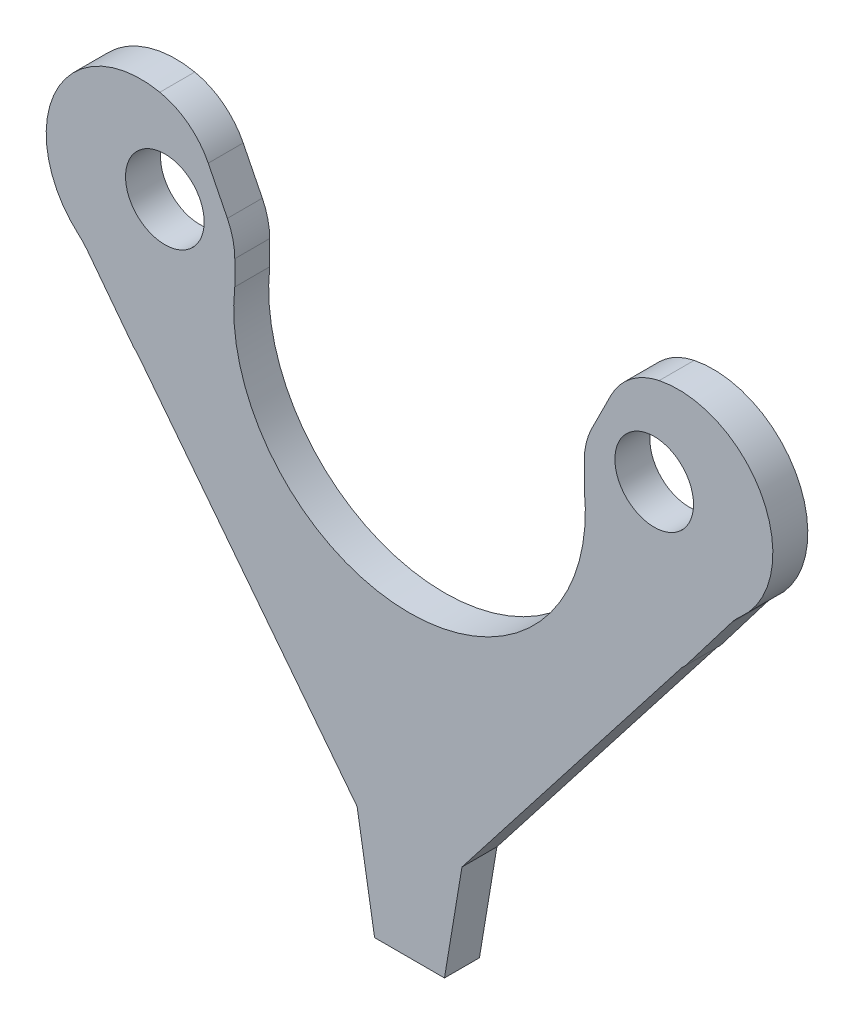
ISO-10303-21;
HEADER;
FILE_DESCRIPTION(('STEP AP214'),'2;1');
FILE_NAME('part.step','',(''),(''),'','','');
FILE_SCHEMA(('AUTOMOTIVE_DESIGN { 1 0 10303 214 1 1 1 1 }'));
ENDSEC;
DATA;
#1=APPLICATION_CONTEXT('core data for automotive mechanical design processes');
#2=APPLICATION_PROTOCOL_DEFINITION('international standard','automotive_design',2000,#1);
#3=PRODUCT_CONTEXT('',#1,'mechanical');
#4=PRODUCT('Part','Part','',(#3));
#5=PRODUCT_RELATED_PRODUCT_CATEGORY('part','',(#4));
#6=PRODUCT_DEFINITION_FORMATION('','',#4);
#7=PRODUCT_DEFINITION_CONTEXT('part definition',#1,'design');
#8=PRODUCT_DEFINITION('design','',#6,#7);
#9=PRODUCT_DEFINITION_SHAPE('','',#8);
#10=(LENGTH_UNIT() NAMED_UNIT(*) SI_UNIT(.MILLI.,.METRE.));
#11=(NAMED_UNIT(*) PLANE_ANGLE_UNIT() SI_UNIT($,.RADIAN.));
#12=(NAMED_UNIT(*) SI_UNIT($,.STERADIAN.) SOLID_ANGLE_UNIT());
#13=UNCERTAINTY_MEASURE_WITH_UNIT(LENGTH_MEASURE(1.E-05),#10,'distance_accuracy_value','');
#14=(GEOMETRIC_REPRESENTATION_CONTEXT(3) GLOBAL_UNCERTAINTY_ASSIGNED_CONTEXT((#13)) GLOBAL_UNIT_ASSIGNED_CONTEXT((#10,
#11,#12)) REPRESENTATION_CONTEXT('',''));
#15=CARTESIAN_POINT('',(0.,0.,0.));
#16=DIRECTION('',(0.,0.,1.));
#17=DIRECTION('',(1.,0.,0.));
#18=AXIS2_PLACEMENT_3D('',#15,#16,#17);
#19=CARTESIAN_POINT('',(130.349468902601,-21.7249114837666,12.7));
#20=DIRECTION('',(0.986393923832144,-0.164398987305356,0.));
#21=DIRECTION('',(0.164398987305356,0.986393923832144,0.));
#22=AXIS2_PLACEMENT_3D('',#19,#20,#21);
#23=PLANE('',#22);
#24=DIRECTION('',(-0.164398987305356,-0.986393923832144,0.));
#25=VECTOR('',#24,1.);
#26=CARTESIAN_POINT('',(130.349468902601,-21.7249114837666,0.));
#27=LINE('',#26,#25);
#28=CARTESIAN_POINT('',(107.95,-156.121724899372,0.));
#29=VERTEX_POINT('',#28);
#30=CARTESIAN_POINT('',(101.6,-194.221724899372,0.));
#31=VERTEX_POINT('',#30);
#32=EDGE_CURVE('E213',#29,#31,#27,.T.);
#33=ORIENTED_EDGE('',*,*,#32,.F.);
#34=DIRECTION('',(0.,0.,-1.));
#35=VECTOR('',#34,1.);
#36=CARTESIAN_POINT('',(107.95,-156.121724899372,12.7));
#37=LINE('',#36,#35);
#38=CARTESIAN_POINT('',(107.95,-156.121724899372,12.7));
#39=VERTEX_POINT('',#38);
#40=EDGE_CURVE('E11',#39,#29,#37,.T.);
#41=ORIENTED_EDGE('',*,*,#40,.F.);
#42=DIRECTION('',(-0.164398987305356,-0.986393923832144,0.));
#43=VECTOR('',#42,1.);
#44=CARTESIAN_POINT('',(130.349468902601,-21.7249114837666,12.7));
#45=LINE('',#44,#43);
#46=CARTESIAN_POINT('',(101.6,-194.221724899372,12.7));
#47=VERTEX_POINT('',#46);
#48=EDGE_CURVE('E269',#39,#47,#45,.T.);
#49=ORIENTED_EDGE('',*,*,#48,.T.);
#50=DIRECTION('',(0.,0.,-1.));
#51=VECTOR('',#50,1.);
#52=CARTESIAN_POINT('',(101.6,-194.221724899372,12.7));
#53=LINE('',#52,#51);
#54=EDGE_CURVE('E59',#47,#31,#53,.T.);
#55=ORIENTED_EDGE('',*,*,#54,.T.);
#56=EDGE_LOOP('',(#33,#41,#49,#55));
#57=FACE_BOUND('',#56,.T.);
#58=ADVANCED_FACE('F43',(#57),#23,.T.);
#59=CARTESIAN_POINT('',(120.649999999999,-120.65,12.7));
#60=DIRECTION('',(0.707106781186545,-0.70710678118655,0.));
#61=DIRECTION('',(0.70710678118655,0.707106781186545,0.));
#62=AXIS2_PLACEMENT_3D('',#59,#60,#61);
#63=PLANE('',#62);
#64=DIRECTION('',(0.,0.,1.));
#65=VECTOR('',#64,1.);
#66=CARTESIAN_POINT('',(187.778287722503,-53.5217122774967,12.7));
#67=LINE('',#66,#65);
#68=CARTESIAN_POINT('',(187.778287722503,-53.5217122774967,0.));
#69=VERTEX_POINT('',#68);
#70=CARTESIAN_POINT('',(187.778287722503,-53.5217122774967,12.7));
#71=VERTEX_POINT('',#70);
#72=EDGE_CURVE('E313',#69,#71,#67,.T.);
#73=ORIENTED_EDGE('',*,*,#72,.F.);
#74=DIRECTION('',(-0.70710678118655,-0.707106781186545,0.));
#75=VECTOR('',#74,1.);
#76=CARTESIAN_POINT('',(120.649999999999,-120.65,0.));
#77=LINE('',#76,#75);
#78=CARTESIAN_POINT('',(189.223585694968,-52.0764143050314,0.));
#79=VERTEX_POINT('',#78);
#80=EDGE_CURVE('E215',#79,#69,#77,.T.);
#81=ORIENTED_EDGE('',*,*,#80,.F.);
#82=DIRECTION('',(0.,0.,-1.));
#83=VECTOR('',#82,1.);
#84=CARTESIAN_POINT('',(189.223585694968,-52.0764143050314,12.7));
#85=LINE('',#84,#83);
#86=CARTESIAN_POINT('',(189.223585694968,-52.0764143050314,12.7));
#87=VERTEX_POINT('',#86);
#88=EDGE_CURVE('E51',#87,#79,#85,.T.);
#89=ORIENTED_EDGE('',*,*,#88,.F.);
#90=DIRECTION('',(-0.70710678118655,-0.707106781186545,0.));
#91=VECTOR('',#90,1.);
#92=CARTESIAN_POINT('',(120.649999999999,-120.65,12.7));
#93=LINE('',#92,#91);
#94=EDGE_CURVE('E330',#87,#71,#93,.T.);
#95=ORIENTED_EDGE('',*,*,#94,.T.);
#96=EDGE_LOOP('',(#73,#81,#89,#95));
#97=FACE_BOUND('',#96,.T.);
#98=ADVANCED_FACE('F310',(#97),#63,.T.);
#99=CARTESIAN_POINT('',(144.680527601621,-110.433120373944,12.7));
#100=DIRECTION('',(0.794900810001238,-0.606739402263752,0.));
#101=DIRECTION('',(0.606739402263752,0.794900810001238,0.));
#102=AXIS2_PLACEMENT_3D('',#99,#100,#101);
#103=PLANE('',#102);
#104=DIRECTION('',(-0.606739402263752,-0.794900810001238,0.));
#105=VECTOR('',#104,1.);
#106=CARTESIAN_POINT('',(144.680527601621,-110.433120373944,0.));
#107=LINE('',#106,#105);
#108=CARTESIAN_POINT('',(205.807722740984,-30.3492215071599,0.));
#109=VERTEX_POINT('',#108);
#110=EDGE_CURVE('E219',#109,#79,#107,.T.);
#111=ORIENTED_EDGE('',*,*,#110,.F.);
#112=DIRECTION('',(0.,0.,-1.));
#113=VECTOR('',#112,1.);
#114=CARTESIAN_POINT('',(205.807722740984,-30.3492215071599,12.7));
#115=LINE('',#114,#113);
#116=CARTESIAN_POINT('',(205.807722740984,-30.3492215071599,12.7));
#117=VERTEX_POINT('',#116);
#118=EDGE_CURVE('E302',#117,#109,#115,.T.);
#119=ORIENTED_EDGE('',*,*,#118,.F.);
#120=DIRECTION('',(-0.606739402263752,-0.794900810001238,0.));
#121=VECTOR('',#120,1.);
#122=CARTESIAN_POINT('',(144.680527601621,-110.433120373944,12.7));
#123=LINE('',#122,#121);
#124=EDGE_CURVE('E308',#117,#87,#123,.T.);
#125=ORIENTED_EDGE('',*,*,#124,.T.);
#126=ORIENTED_EDGE('',*,*,#88,.T.);
#127=EDGE_LOOP('',(#111,#119,#125,#126));
#128=FACE_BOUND('',#127,.T.);
#129=ADVANCED_FACE('F306',(#128),#103,.T.);
#130=CARTESIAN_POINT('',(225.998203315016,-45.7604023246592,12.7));
#131=DIRECTION('',(0.,0.,-1.));
#132=DIRECTION('',(-1.,0.,0.));
#133=AXIS2_PLACEMENT_3D('',#130,#131,#132);
#134=CYLINDRICAL_SURFACE('',#133,25.4);
#135=CARTESIAN_POINT('',(225.998203315016,-45.7604023246592,0.));
#136=DIRECTION('',(0.,0.,1.));
#137=DIRECTION('',(1.,0.,0.));
#138=AXIS2_PLACEMENT_3D('',#135,#136,#137);
#139=CIRCLE('',#138,25.4);
#140=CARTESIAN_POINT('',(209.233481122649,-26.6788905970009,0.));
#141=VERTEX_POINT('',#140);
#142=EDGE_CURVE('E222',#141,#109,#139,.T.);
#143=ORIENTED_EDGE('',*,*,#142,.F.);
#144=DIRECTION('',(0.,0.,-1.));
#145=VECTOR('',#144,1.);
#146=CARTESIAN_POINT('',(209.233481122649,-26.6788905970009,12.7));
#147=LINE('',#146,#145);
#148=CARTESIAN_POINT('',(209.233481122649,-26.6788905970009,12.7));
#149=VERTEX_POINT('',#148);
#150=EDGE_CURVE('E300',#149,#141,#147,.T.);
#151=ORIENTED_EDGE('',*,*,#150,.F.);
#152=CARTESIAN_POINT('',(225.998203315016,-45.7604023246592,12.7));
#153=DIRECTION('',(0.,0.,1.));
#154=DIRECTION('',(1.,0.,0.));
#155=AXIS2_PLACEMENT_3D('',#152,#153,#154);
#156=CIRCLE('',#155,25.4);
#157=EDGE_CURVE('E326',#149,#117,#156,.T.);
#158=ORIENTED_EDGE('',*,*,#157,.T.);
#159=ORIENTED_EDGE('',*,*,#118,.T.);
#160=EDGE_LOOP('',(#143,#151,#158,#159));
#161=FACE_BOUND('',#160,.T.);
#162=ADVANCED_FACE('F323',(#161),#134,.F.);
#163=CARTESIAN_POINT('',(186.557381491786,-0.869082591899415,12.7));
#164=DIRECTION('',(0.,0.,-1.));
#165=DIRECTION('',(-1.,0.,0.));
#166=AXIS2_PLACEMENT_3D('',#163,#164,#165);
#167=CYLINDRICAL_SURFACE('',#166,34.3562466478661);
#168=CARTESIAN_POINT('',(186.557381491786,-0.869082591899415,0.));
#169=DIRECTION('',(0.,0.,1.));
#170=DIRECTION('',(1.,0.,0.));
#171=AXIS2_PLACEMENT_3D('',#168,#169,#170);
#172=CIRCLE('',#171,34.3562466478661);
#173=CARTESIAN_POINT('',(179.622173443983,32.7799080774014,0.));
#174=VERTEX_POINT('',#173);
#175=EDGE_CURVE('E225',#174,#141,#172,.F.);
#176=ORIENTED_EDGE('',*,*,#175,.F.);
#177=DIRECTION('',(0.,0.,-1.));
#178=VECTOR('',#177,1.);
#179=CARTESIAN_POINT('',(179.622173443983,32.7799080774014,12.7));
#180=LINE('',#179,#178);
#181=CARTESIAN_POINT('',(179.622173443983,32.7799080774014,12.7));
#182=VERTEX_POINT('',#181);
#183=EDGE_CURVE('E298',#182,#174,#180,.T.);
#184=ORIENTED_EDGE('',*,*,#183,.F.);
#185=CARTESIAN_POINT('',(186.557381491786,-0.869082591899415,12.7));
#186=DIRECTION('',(0.,0.,1.));
#187=DIRECTION('',(1.,0.,0.));
#188=AXIS2_PLACEMENT_3D('',#185,#186,#187);
#189=CIRCLE('',#188,34.3562466478661);
#190=EDGE_CURVE('E332',#182,#149,#189,.F.);
#191=ORIENTED_EDGE('',*,*,#190,.T.);
#192=ORIENTED_EDGE('',*,*,#150,.T.);
#193=EDGE_LOOP('',(#176,#184,#191,#192));
#194=FACE_BOUND('',#193,.T.);
#195=ADVANCED_FACE('F413',(#194),#167,.T.);
#196=CARTESIAN_POINT('',(184.749458919014,7.90279120953404,12.7));
#197=DIRECTION('',(0.,0.,-1.));
#198=DIRECTION('',(-1.,0.,0.));
#199=AXIS2_PLACEMENT_3D('',#196,#197,#198);
#200=CYLINDRICAL_SURFACE('',#199,25.4);
#201=CARTESIAN_POINT('',(184.749458919014,7.90279120953404,0.));
#202=DIRECTION('',(0.,0.,1.));
#203=DIRECTION('',(1.,0.,0.));
#204=AXIS2_PLACEMENT_3D('',#201,#202,#203);
#205=CIRCLE('',#204,25.4);
#206=CARTESIAN_POINT('',(162.031008267616,19.2620165352329,0.));
#207=VERTEX_POINT('',#206);
#208=EDGE_CURVE('E228',#174,#207,#205,.T.);
#209=ORIENTED_EDGE('',*,*,#208,.T.);
#210=DIRECTION('',(0.,0.,-1.));
#211=VECTOR('',#210,1.);
#212=CARTESIAN_POINT('',(162.031008267616,19.2620165352329,12.7));
#213=LINE('',#212,#211);
#214=CARTESIAN_POINT('',(162.031008267616,19.2620165352329,12.7));
#215=VERTEX_POINT('',#214);
#216=EDGE_CURVE('E295',#215,#207,#213,.T.);
#217=ORIENTED_EDGE('',*,*,#216,.F.);
#218=CARTESIAN_POINT('',(184.749458919014,7.90279120953404,12.7));
#219=DIRECTION('',(0.,0.,1.));
#220=DIRECTION('',(1.,0.,0.));
#221=AXIS2_PLACEMENT_3D('',#218,#219,#220);
#222=CIRCLE('',#221,25.4);
#223=EDGE_CURVE('E338',#182,#215,#222,.T.);
#224=ORIENTED_EDGE('',*,*,#223,.F.);
#225=ORIENTED_EDGE('',*,*,#183,.T.);
#226=EDGE_LOOP('',(#209,#217,#224,#225));
#227=FACE_BOUND('',#226,.T.);
#228=ADVANCED_FACE('F415',(#227),#200,.T.);
#229=CARTESIAN_POINT('',(121.92,-60.9599999999999,12.7));
#230=DIRECTION('',(0.894427190999916,-0.447213595499957,0.));
#231=DIRECTION('',(0.447213595499957,0.894427190999917,0.));
#232=AXIS2_PLACEMENT_3D('',#229,#230,#231);
#233=PLANE('',#232);
#234=DIRECTION('',(-0.447213595499957,-0.894427190999917,0.));
#235=VECTOR('',#234,1.);
#236=CARTESIAN_POINT('',(121.92,-60.9599999999999,0.));
#237=LINE('',#236,#235);
#238=CARTESIAN_POINT('',(155.081549348602,5.36309869720436,0.));
#239=VERTEX_POINT('',#238);
#240=EDGE_CURVE('E230',#207,#239,#237,.T.);
#241=ORIENTED_EDGE('',*,*,#240,.T.);
#242=DIRECTION('',(0.,0.,-1.));
#243=VECTOR('',#242,1.);
#244=CARTESIAN_POINT('',(155.081549348602,5.36309869720436,12.7));
#245=LINE('',#244,#243);
#246=CARTESIAN_POINT('',(155.081549348602,5.36309869720436,12.7));
#247=VERTEX_POINT('',#246);
#248=EDGE_CURVE('E293',#247,#239,#245,.T.);
#249=ORIENTED_EDGE('',*,*,#248,.F.);
#250=DIRECTION('',(-0.447213595499957,-0.894427190999917,0.));
#251=VECTOR('',#250,1.);
#252=CARTESIAN_POINT('',(121.92,-60.9599999999999,12.7));
#253=LINE('',#252,#251);
#254=EDGE_CURVE('E340',#215,#247,#253,.T.);
#255=ORIENTED_EDGE('',*,*,#254,.F.);
#256=ORIENTED_EDGE('',*,*,#216,.T.);
#257=EDGE_LOOP('',(#241,#249,#255,#256));
#258=FACE_BOUND('',#257,.T.);
#259=ADVANCED_FACE('F409',(#258),#233,.F.);
#260=CARTESIAN_POINT('',(177.8,-5.99612662849465,12.7));
#261=DIRECTION('',(0.,0.,-1.));
#262=DIRECTION('',(-1.,0.,0.));
#263=AXIS2_PLACEMENT_3D('',#260,#261,#262);
#264=CYLINDRICAL_SURFACE('',#263,25.4);
#265=CARTESIAN_POINT('',(177.8,-5.99612662849465,0.));
#266=DIRECTION('',(0.,0.,1.));
#267=DIRECTION('',(1.,0.,0.));
#268=AXIS2_PLACEMENT_3D('',#265,#266,#267);
#269=CIRCLE('',#268,25.4);
#270=CARTESIAN_POINT('',(152.4,-5.99612662849475,0.));
#271=VERTEX_POINT('',#270);
#272=EDGE_CURVE('E233',#271,#239,#269,.F.);
#273=ORIENTED_EDGE('',*,*,#272,.F.);
#274=DIRECTION('',(0.,0.,-1.));
#275=VECTOR('',#274,1.);
#276=CARTESIAN_POINT('',(152.4,-5.99612662849475,12.7));
#277=LINE('',#276,#275);
#278=CARTESIAN_POINT('',(152.4,-5.99612662849475,12.7));
#279=VERTEX_POINT('',#278);
#280=EDGE_CURVE('E291',#279,#271,#277,.T.);
#281=ORIENTED_EDGE('',*,*,#280,.F.);
#282=CARTESIAN_POINT('',(177.8,-5.99612662849465,12.7));
#283=DIRECTION('',(0.,0.,1.));
#284=DIRECTION('',(1.,0.,0.));
#285=AXIS2_PLACEMENT_3D('',#282,#283,#284);
#286=CIRCLE('',#285,25.4);
#287=EDGE_CURVE('E342',#279,#247,#286,.F.);
#288=ORIENTED_EDGE('',*,*,#287,.T.);
#289=ORIENTED_EDGE('',*,*,#248,.T.);
#290=EDGE_LOOP('',(#273,#281,#288,#289));
#291=FACE_BOUND('',#290,.T.);
#292=ADVANCED_FACE('F405',(#291),#264,.T.);
#293=CARTESIAN_POINT('',(152.4,0.,12.7));
#294=DIRECTION('',(1.,0.,0.));
#295=DIRECTION('',(0.,0.,-1.));
#296=AXIS2_PLACEMENT_3D('',#293,#294,#295);
#297=PLANE('',#296);
#298=DIRECTION('',(0.,-1.,0.));
#299=VECTOR('',#298,1.);
#300=CARTESIAN_POINT('',(152.4,0.,0.));
#301=LINE('',#300,#299);
#302=CARTESIAN_POINT('',(152.4,-14.8789755157232,0.));
#303=VERTEX_POINT('',#302);
#304=EDGE_CURVE('E236',#271,#303,#301,.T.);
#305=ORIENTED_EDGE('',*,*,#304,.T.);
#306=DIRECTION('',(0.,0.,-1.));
#307=VECTOR('',#306,1.);
#308=CARTESIAN_POINT('',(152.4,-14.8789755157232,12.7));
#309=LINE('',#308,#307);
#310=CARTESIAN_POINT('',(152.4,-14.8789755157232,12.7));
#311=VERTEX_POINT('',#310);
#312=EDGE_CURVE('E289',#311,#303,#309,.T.);
#313=ORIENTED_EDGE('',*,*,#312,.F.);
#314=DIRECTION('',(0.,-1.,0.));
#315=VECTOR('',#314,1.);
#316=CARTESIAN_POINT('',(152.4,0.,12.7));
#317=LINE('',#316,#315);
#318=EDGE_CURVE('E345',#279,#311,#317,.T.);
#319=ORIENTED_EDGE('',*,*,#318,.F.);
#320=ORIENTED_EDGE('',*,*,#280,.T.);
#321=EDGE_LOOP('',(#305,#313,#319,#320));
#322=FACE_BOUND('',#321,.T.);
#323=ADVANCED_FACE('F400',(#322),#297,.F.);
#324=CARTESIAN_POINT('',(25.4,0.,12.7));
#325=DIRECTION('',(1.,0.,0.));
#326=DIRECTION('',(0.,0.,-1.));
#327=AXIS2_PLACEMENT_3D('',#324,#325,#326);
#328=PLANE('',#327);
#329=DIRECTION('',(0.,-1.,0.));
#330=VECTOR('',#329,1.);
#331=CARTESIAN_POINT('',(25.4,0.,0.));
#332=LINE('',#331,#330);
#333=CARTESIAN_POINT('',(25.4,-5.99612662849475,0.));
#334=VERTEX_POINT('',#333);
#335=CARTESIAN_POINT('',(25.4,-14.8789755157232,0.));
#336=VERTEX_POINT('',#335);
#337=EDGE_CURVE('E239',#334,#336,#332,.T.);
#338=ORIENTED_EDGE('',*,*,#337,.F.);
#339=DIRECTION('',(0.,0.,-1.));
#340=VECTOR('',#339,1.);
#341=CARTESIAN_POINT('',(25.4,-5.99612662849475,12.7));
#342=LINE('',#341,#340);
#343=CARTESIAN_POINT('',(25.4,-5.99612662849475,12.7));
#344=VERTEX_POINT('',#343);
#345=EDGE_CURVE('E284',#344,#334,#342,.T.);
#346=ORIENTED_EDGE('',*,*,#345,.F.);
#347=DIRECTION('',(0.,-1.,0.));
#348=VECTOR('',#347,1.);
#349=CARTESIAN_POINT('',(25.4,0.,12.7));
#350=LINE('',#349,#348);
#351=CARTESIAN_POINT('',(25.4,-14.8789755157232,12.7));
#352=VERTEX_POINT('',#351);
#353=EDGE_CURVE('E348',#344,#352,#350,.T.);
#354=ORIENTED_EDGE('',*,*,#353,.T.);
#355=DIRECTION('',(0.,0.,-1.));
#356=VECTOR('',#355,1.);
#357=CARTESIAN_POINT('',(25.4,-14.8789755157232,12.7));
#358=LINE('',#357,#356);
#359=EDGE_CURVE('E286',#352,#336,#358,.T.);
#360=ORIENTED_EDGE('',*,*,#359,.T.);
#361=EDGE_LOOP('',(#338,#346,#354,#360));
#362=FACE_BOUND('',#361,.T.);
#363=ADVANCED_FACE('F471',(#362),#328,.T.);
#364=CARTESIAN_POINT('',(0.,-5.99612662849466,12.7));
#365=DIRECTION('',(0.,0.,-1.));
#366=DIRECTION('',(-1.,0.,0.));
#367=AXIS2_PLACEMENT_3D('',#364,#365,#366);
#368=CYLINDRICAL_SURFACE('',#367,25.4);
#369=CARTESIAN_POINT('',(0.,-5.99612662849466,0.));
#370=DIRECTION('',(0.,0.,1.));
#371=DIRECTION('',(1.,0.,0.));
#372=AXIS2_PLACEMENT_3D('',#369,#370,#371);
#373=CIRCLE('',#372,25.4);
#374=CARTESIAN_POINT('',(22.7184506513978,5.36309869720436,0.));
#375=VERTEX_POINT('',#374);
#376=EDGE_CURVE('E242',#334,#375,#373,.T.);
#377=ORIENTED_EDGE('',*,*,#376,.T.);
#378=DIRECTION('',(0.,0.,-1.));
#379=VECTOR('',#378,1.);
#380=CARTESIAN_POINT('',(22.7184506513978,5.36309869720436,12.7));
#381=LINE('',#380,#379);
#382=CARTESIAN_POINT('',(22.7184506513978,5.36309869720436,12.7));
#383=VERTEX_POINT('',#382);
#384=EDGE_CURVE('E282',#383,#375,#381,.T.);
#385=ORIENTED_EDGE('',*,*,#384,.F.);
#386=CARTESIAN_POINT('',(0.,-5.99612662849466,12.7));
#387=DIRECTION('',(0.,0.,1.));
#388=DIRECTION('',(1.,0.,0.));
#389=AXIS2_PLACEMENT_3D('',#386,#387,#388);
#390=CIRCLE('',#389,25.4);
#391=EDGE_CURVE('E351',#344,#383,#390,.T.);
#392=ORIENTED_EDGE('',*,*,#391,.F.);
#393=ORIENTED_EDGE('',*,*,#345,.T.);
#394=EDGE_LOOP('',(#377,#385,#392,#393));
#395=FACE_BOUND('',#394,.T.);
#396=ADVANCED_FACE('F467',(#395),#368,.T.);
#397=CARTESIAN_POINT('',(20.32,10.16,12.7));
#398=DIRECTION('',(0.894427190999916,0.447213595499958,0.));
#399=DIRECTION('',(-0.447213595499958,0.894427190999916,0.));
#400=AXIS2_PLACEMENT_3D('',#397,#398,#399);
#401=PLANE('',#400);
#402=DIRECTION('',(0.447213595499958,-0.894427190999916,0.));
#403=VECTOR('',#402,1.);
#404=CARTESIAN_POINT('',(20.32,10.16,0.));
#405=LINE('',#404,#403);
#406=CARTESIAN_POINT('',(15.7689917323835,19.262016535233,0.));
#407=VERTEX_POINT('',#406);
#408=EDGE_CURVE('E245',#407,#375,#405,.T.);
#409=ORIENTED_EDGE('',*,*,#408,.F.);
#410=DIRECTION('',(0.,0.,-1.));
#411=VECTOR('',#410,1.);
#412=CARTESIAN_POINT('',(15.7689917323835,19.262016535233,12.7));
#413=LINE('',#412,#411);
#414=CARTESIAN_POINT('',(15.7689917323835,19.262016535233,12.7));
#415=VERTEX_POINT('',#414);
#416=EDGE_CURVE('E280',#415,#407,#413,.T.);
#417=ORIENTED_EDGE('',*,*,#416,.F.);
#418=DIRECTION('',(0.447213595499958,-0.894427190999916,0.));
#419=VECTOR('',#418,1.);
#420=CARTESIAN_POINT('',(20.32,10.16,12.7));
#421=LINE('',#420,#419);
#422=EDGE_CURVE('E353',#415,#383,#421,.T.);
#423=ORIENTED_EDGE('',*,*,#422,.T.);
#424=ORIENTED_EDGE('',*,*,#384,.T.);
#425=EDGE_LOOP('',(#409,#417,#423,#424));
#426=FACE_BOUND('',#425,.T.);
#427=ADVANCED_FACE('F463',(#426),#401,.T.);
#428=CARTESIAN_POINT('',(-6.94945891901435,7.90279120953404,12.7));
#429=DIRECTION('',(0.,0.,-1.));
#430=DIRECTION('',(-1.,0.,0.));
#431=AXIS2_PLACEMENT_3D('',#428,#429,#430);
#432=CYLINDRICAL_SURFACE('',#431,25.4);
#433=CARTESIAN_POINT('',(-6.94945891901435,7.90279120953404,0.));
#434=DIRECTION('',(0.,0.,1.));
#435=DIRECTION('',(1.,0.,0.));
#436=AXIS2_PLACEMENT_3D('',#433,#434,#435);
#437=CIRCLE('',#436,25.4);
#438=CARTESIAN_POINT('',(-1.82217344398289,32.7799080774014,0.));
#439=VERTEX_POINT('',#438);
#440=EDGE_CURVE('E248',#439,#407,#437,.F.);
#441=ORIENTED_EDGE('',*,*,#440,.F.);
#442=DIRECTION('',(0.,0.,-1.));
#443=VECTOR('',#442,1.);
#444=CARTESIAN_POINT('',(-1.82217344398289,32.7799080774014,12.7));
#445=LINE('',#444,#443);
#446=CARTESIAN_POINT('',(-1.82217344398289,32.7799080774014,12.7));
#447=VERTEX_POINT('',#446);
#448=EDGE_CURVE('E278',#447,#439,#445,.T.);
#449=ORIENTED_EDGE('',*,*,#448,.F.);
#450=CARTESIAN_POINT('',(-6.94945891901435,7.90279120953404,12.7));
#451=DIRECTION('',(0.,0.,1.));
#452=DIRECTION('',(1.,0.,0.));
#453=AXIS2_PLACEMENT_3D('',#450,#451,#452);
#454=CIRCLE('',#453,25.4);
#455=EDGE_CURVE('E356',#447,#415,#454,.F.);
#456=ORIENTED_EDGE('',*,*,#455,.T.);
#457=ORIENTED_EDGE('',*,*,#416,.T.);
#458=EDGE_LOOP('',(#441,#449,#456,#457));
#459=FACE_BOUND('',#458,.T.);
#460=ADVANCED_FACE('F460',(#459),#432,.T.);
#461=CARTESIAN_POINT('',(-8.75738149178612,-0.869082591899424,12.7));
#462=DIRECTION('',(0.,0.,-1.));
#463=DIRECTION('',(-1.,0.,0.));
#464=AXIS2_PLACEMENT_3D('',#461,#462,#463);
#465=CYLINDRICAL_SURFACE('',#464,34.3562466478661);
#466=CARTESIAN_POINT('',(-8.75738149178612,-0.869082591899424,0.));
#467=DIRECTION('',(0.,0.,1.));
#468=DIRECTION('',(1.,0.,0.));
#469=AXIS2_PLACEMENT_3D('',#466,#467,#468);
#470=CIRCLE('',#469,34.3562466478661);
#471=CARTESIAN_POINT('',(-31.4334811226489,-26.6788905970008,0.));
#472=VERTEX_POINT('',#471);
#473=EDGE_CURVE('E251',#439,#472,#470,.T.);
#474=ORIENTED_EDGE('',*,*,#473,.T.);
#475=DIRECTION('',(0.,0.,-1.));
#476=VECTOR('',#475,1.);
#477=CARTESIAN_POINT('',(-31.4334811226489,-26.6788905970008,12.7));
#478=LINE('',#477,#476);
#479=CARTESIAN_POINT('',(-31.4334811226489,-26.6788905970008,12.7));
#480=VERTEX_POINT('',#479);
#481=EDGE_CURVE('E275',#480,#472,#478,.T.);
#482=ORIENTED_EDGE('',*,*,#481,.F.);
#483=CARTESIAN_POINT('',(-8.75738149178612,-0.869082591899424,12.7));
#484=DIRECTION('',(0.,0.,1.));
#485=DIRECTION('',(1.,0.,0.));
#486=AXIS2_PLACEMENT_3D('',#483,#484,#485);
#487=CIRCLE('',#486,34.3562466478661);
#488=EDGE_CURVE('E359',#447,#480,#487,.T.);
#489=ORIENTED_EDGE('',*,*,#488,.F.);
#490=ORIENTED_EDGE('',*,*,#448,.T.);
#491=EDGE_LOOP('',(#474,#482,#489,#490));
#492=FACE_BOUND('',#491,.T.);
#493=ADVANCED_FACE('F365',(#492),#465,.T.);
#494=CARTESIAN_POINT('',(-48.1982033150159,-45.760402324659,12.7));
#495=DIRECTION('',(0.,0.,-1.));
#496=DIRECTION('',(-1.,0.,0.));
#497=AXIS2_PLACEMENT_3D('',#494,#495,#496);
#498=CYLINDRICAL_SURFACE('',#497,25.4);
#499=CARTESIAN_POINT('',(-48.1982033150159,-45.760402324659,0.));
#500=DIRECTION('',(0.,0.,1.));
#501=DIRECTION('',(1.,0.,0.));
#502=AXIS2_PLACEMENT_3D('',#499,#500,#501);
#503=CIRCLE('',#502,25.4);
#504=CARTESIAN_POINT('',(-28.0077227409842,-30.34922150716,0.));
#505=VERTEX_POINT('',#504);
#506=EDGE_CURVE('E253',#472,#505,#503,.F.);
#507=ORIENTED_EDGE('',*,*,#506,.T.);
#508=DIRECTION('',(0.,0.,-1.));
#509=VECTOR('',#508,1.);
#510=CARTESIAN_POINT('',(-28.0077227409842,-30.34922150716,12.7));
#511=LINE('',#510,#509);
#512=CARTESIAN_POINT('',(-28.0077227409842,-30.34922150716,12.7));
#513=VERTEX_POINT('',#512);
#514=EDGE_CURVE('E193',#513,#505,#511,.T.);
#515=ORIENTED_EDGE('',*,*,#514,.F.);
#516=CARTESIAN_POINT('',(-48.1982033150159,-45.760402324659,12.7));
#517=DIRECTION('',(0.,0.,1.));
#518=DIRECTION('',(1.,0.,0.));
#519=AXIS2_PLACEMENT_3D('',#516,#517,#518);
#520=CIRCLE('',#519,25.4);
#521=EDGE_CURVE('E180',#480,#513,#520,.F.);
#522=ORIENTED_EDGE('',*,*,#521,.F.);
#523=ORIENTED_EDGE('',*,*,#481,.T.);
#524=EDGE_LOOP('',(#507,#515,#522,#523));
#525=FACE_BOUND('',#524,.T.);
#526=ADVANCED_FACE('F369',(#525),#498,.F.);
#527=CARTESIAN_POINT('',(-32.3345220633387,-24.6805995696031,12.7));
#528=DIRECTION('',(0.794900810001245,0.606739402263743,0.));
#529=DIRECTION('',(-0.606739402263743,0.794900810001245,0.));
#530=AXIS2_PLACEMENT_3D('',#527,#528,#529);
#531=PLANE('',#530);
#532=DIRECTION('',(0.606739402263743,-0.794900810001245,0.));
#533=VECTOR('',#532,1.);
#534=CARTESIAN_POINT('',(-32.3345220633387,-24.6805995696031,0.));
#535=LINE('',#534,#533);
#536=CARTESIAN_POINT('',(-11.423585694968,-52.076414305032,0.));
#537=VERTEX_POINT('',#536);
#538=EDGE_CURVE('E189',#505,#537,#535,.T.);
#539=ORIENTED_EDGE('',*,*,#538,.T.);
#540=DIRECTION('',(0.,0.,-1.));
#541=VECTOR('',#540,1.);
#542=CARTESIAN_POINT('',(-11.423585694968,-52.076414305032,12.7));
#543=LINE('',#542,#541);
#544=CARTESIAN_POINT('',(-11.423585694968,-52.076414305032,12.7));
#545=VERTEX_POINT('',#544);
#546=EDGE_CURVE('E186',#545,#537,#543,.T.);
#547=ORIENTED_EDGE('',*,*,#546,.F.);
#548=DIRECTION('',(0.606739402263743,-0.794900810001245,0.));
#549=VECTOR('',#548,1.);
#550=CARTESIAN_POINT('',(-32.3345220633387,-24.6805995696031,12.7));
#551=LINE('',#550,#549);
#552=EDGE_CURVE('E171',#513,#545,#551,.T.);
#553=ORIENTED_EDGE('',*,*,#552,.F.);
#554=ORIENTED_EDGE('',*,*,#514,.T.);
#555=EDGE_LOOP('',(#539,#547,#553,#554));
#556=FACE_BOUND('',#555,.T.);
#557=ADVANCED_FACE('F187',(#556),#531,.F.);
#558=CARTESIAN_POINT('',(-31.7499999999998,-31.7500000000006,12.7));
#559=DIRECTION('',(0.707106781186539,0.707106781186556,0.));
#560=DIRECTION('',(-0.707106781186556,0.707106781186539,0.));
#561=AXIS2_PLACEMENT_3D('',#558,#559,#560);
#562=PLANE('',#561);
#563=DIRECTION('',(0.707106781186556,-0.707106781186539,0.));
#564=VECTOR('',#563,1.);
#565=CARTESIAN_POINT('',(-31.7499999999998,-31.7500000000006,0.));
#566=LINE('',#565,#564);
#567=CARTESIAN_POINT('',(-9.9782877225007,-53.5217122774993,0.));
#568=VERTEX_POINT('',#567);
#569=EDGE_CURVE('E256',#537,#568,#566,.T.);
#570=ORIENTED_EDGE('',*,*,#569,.T.);
#571=DIRECTION('',(0.,0.,1.));
#572=VECTOR('',#571,1.);
#573=CARTESIAN_POINT('',(-9.97828772250082,-53.5217122774991,12.7));
#574=LINE('',#573,#572);
#575=CARTESIAN_POINT('',(-9.9782877225007,-53.5217122774993,12.7));
#576=VERTEX_POINT('',#575);
#577=EDGE_CURVE('E199',#568,#576,#574,.T.);
#578=ORIENTED_EDGE('',*,*,#577,.T.);
#579=DIRECTION('',(0.707106781186556,-0.707106781186539,0.));
#580=VECTOR('',#579,1.);
#581=CARTESIAN_POINT('',(-31.7499999999998,-31.7500000000006,12.7));
#582=LINE('',#581,#580);
#583=EDGE_CURVE('E178',#545,#576,#582,.T.);
#584=ORIENTED_EDGE('',*,*,#583,.F.);
#585=ORIENTED_EDGE('',*,*,#546,.T.);
#586=EDGE_LOOP('',(#570,#578,#584,#585));
#587=FACE_BOUND('',#586,.T.);
#588=ADVANCED_FACE('F197',(#587),#562,.F.);
#589=CARTESIAN_POINT('',(42.645125691994,7.10752094866562,12.7));
#590=DIRECTION('',(0.986393923832144,0.164398987305356,0.));
#591=DIRECTION('',(-0.164398987305356,0.986393923832144,0.));
#592=AXIS2_PLACEMENT_3D('',#589,#590,#591);
#593=PLANE('',#592);
#594=DIRECTION('',(0.164398987305356,-0.986393923832144,0.));
#595=VECTOR('',#594,1.);
#596=CARTESIAN_POINT('',(42.645125691994,7.10752094866562,0.));
#597=LINE('',#596,#595);
#598=CARTESIAN_POINT('',(69.85,-156.121724899372,0.));
#599=VERTEX_POINT('',#598);
#600=CARTESIAN_POINT('',(76.2,-194.221724899372,0.));
#601=VERTEX_POINT('',#600);
#602=EDGE_CURVE('E258',#599,#601,#597,.T.);
#603=ORIENTED_EDGE('',*,*,#602,.T.);
#604=DIRECTION('',(0.,0.,-1.));
#605=VECTOR('',#604,1.);
#606=CARTESIAN_POINT('',(76.2,-194.221724899372,12.7));
#607=LINE('',#606,#605);
#608=CARTESIAN_POINT('',(76.2,-194.221724899372,12.7));
#609=VERTEX_POINT('',#608);
#610=EDGE_CURVE('E117',#609,#601,#607,.T.);
#611=ORIENTED_EDGE('',*,*,#610,.F.);
#612=DIRECTION('',(0.164398987305356,-0.986393923832144,0.));
#613=VECTOR('',#612,1.);
#614=CARTESIAN_POINT('',(42.645125691994,7.10752094866562,12.7));
#615=LINE('',#614,#613);
#616=CARTESIAN_POINT('',(69.85,-156.121724899372,12.7));
#617=VERTEX_POINT('',#616);
#618=EDGE_CURVE('E200',#617,#609,#615,.T.);
#619=ORIENTED_EDGE('',*,*,#618,.F.);
#620=DIRECTION('',(0.,0.,-1.));
#621=VECTOR('',#620,1.);
#622=CARTESIAN_POINT('',(69.85,-156.121724899372,12.7));
#623=LINE('',#622,#621);
#624=EDGE_CURVE('E194',#617,#599,#623,.T.);
#625=ORIENTED_EDGE('',*,*,#624,.T.);
#626=EDGE_LOOP('',(#603,#611,#619,#625));
#627=FACE_BOUND('',#626,.T.);
#628=ADVANCED_FACE('F445',(#627),#593,.F.);
#629=CARTESIAN_POINT('',(0.,0.,12.7));
#630=DIRECTION('',(0.,0.,-1.));
#631=DIRECTION('',(-1.,0.,0.));
#632=AXIS2_PLACEMENT_3D('',#629,#630,#631);
#633=CYLINDRICAL_SURFACE('',#632,14.2875);
#634=CARTESIAN_POINT('',(0.,0.,12.7));
#635=DIRECTION('',(0.,0.,1.));
#636=DIRECTION('',(1.,0.,0.));
#637=AXIS2_PLACEMENT_3D('',#634,#635,#636);
#638=CIRCLE('',#637,14.2875);
#639=CARTESIAN_POINT('',(14.2875,0.,12.7));
#640=VERTEX_POINT('',#639);
#641=EDGE_CURVE('E207',#640,#640,#638,.T.);
#642=ORIENTED_EDGE('',*,*,#641,.T.);
#643=EDGE_LOOP('',(#642));
#644=FACE_BOUND('',#643,.T.);
#645=CARTESIAN_POINT('',(0.,0.,0.));
#646=DIRECTION('',(0.,0.,1.));
#647=DIRECTION('',(1.,0.,0.));
#648=AXIS2_PLACEMENT_3D('',#645,#646,#647);
#649=CIRCLE('',#648,14.2875);
#650=CARTESIAN_POINT('',(14.2875,0.,0.));
#651=VERTEX_POINT('',#650);
#652=EDGE_CURVE('E263',#651,#651,#649,.T.);
#653=ORIENTED_EDGE('',*,*,#652,.F.);
#654=EDGE_LOOP('',(#653));
#655=FACE_BOUND('',#654,.T.);
#656=ADVANCED_FACE('F437',(#644,#655),#633,.F.);
#657=CARTESIAN_POINT('',(0.,-194.221724899372,12.7));
#658=DIRECTION('',(0.,-1.,0.));
#659=DIRECTION('',(0.,0.,-1.));
#660=AXIS2_PLACEMENT_3D('',#657,#658,#659);
#661=PLANE('',#660);
#662=DIRECTION('',(-1.,0.,0.));
#663=VECTOR('',#662,1.);
#664=CARTESIAN_POINT('',(0.,-194.221724899372,0.));
#665=LINE('',#664,#663);
#666=EDGE_CURVE('E260',#31,#601,#665,.T.);
#667=ORIENTED_EDGE('',*,*,#666,.F.);
#668=ORIENTED_EDGE('',*,*,#54,.F.);
#669=DIRECTION('',(-1.,0.,0.));
#670=VECTOR('',#669,1.);
#671=CARTESIAN_POINT('',(0.,-194.221724899372,12.7));
#672=LINE('',#671,#670);
#673=EDGE_CURVE('E202',#47,#609,#672,.T.);
#674=ORIENTED_EDGE('',*,*,#673,.T.);
#675=ORIENTED_EDGE('',*,*,#610,.T.);
#676=EDGE_LOOP('',(#667,#668,#674,#675));
#677=FACE_BOUND('',#676,.T.);
#678=ADVANCED_FACE('F434',(#677),#661,.T.);
#679=CARTESIAN_POINT('',(177.8,0.,12.7));
#680=DIRECTION('',(0.,0.,-1.));
#681=DIRECTION('',(-1.,0.,0.));
#682=AXIS2_PLACEMENT_3D('',#679,#680,#681);
#683=CYLINDRICAL_SURFACE('',#682,14.2875);
#684=CARTESIAN_POINT('',(177.8,0.,12.7));
#685=DIRECTION('',(0.,0.,1.));
#686=DIRECTION('',(1.,0.,0.));
#687=AXIS2_PLACEMENT_3D('',#684,#685,#686);
#688=CIRCLE('',#687,14.2875);
#689=CARTESIAN_POINT('',(192.0875,0.,12.7));
#690=VERTEX_POINT('',#689);
#691=EDGE_CURVE('E210',#690,#690,#688,.T.);
#692=ORIENTED_EDGE('',*,*,#691,.T.);
#693=EDGE_LOOP('',(#692));
#694=FACE_BOUND('',#693,.T.);
#695=CARTESIAN_POINT('',(177.8,0.,0.));
#696=DIRECTION('',(0.,0.,1.));
#697=DIRECTION('',(1.,0.,0.));
#698=AXIS2_PLACEMENT_3D('',#695,#696,#697);
#699=CIRCLE('',#698,14.2875);
#700=CARTESIAN_POINT('',(192.0875,0.,0.));
#701=VERTEX_POINT('',#700);
#702=EDGE_CURVE('E266',#701,#701,#699,.T.);
#703=ORIENTED_EDGE('',*,*,#702,.F.);
#704=EDGE_LOOP('',(#703));
#705=FACE_BOUND('',#704,.T.);
#706=ADVANCED_FACE('F436',(#694,#705),#683,.F.);
#707=CARTESIAN_POINT('',(0.,0.,12.7));
#708=DIRECTION('',(0.,0.,1.));
#709=DIRECTION('',(1.,0.,0.));
#710=AXIS2_PLACEMENT_3D('',#707,#708,#709);
#711=PLANE('',#710);
#712=ORIENTED_EDGE('',*,*,#583,.T.);
#713=DIRECTION('',(-0.614076140355459,0.789246788936225,0.));
#714=VECTOR('',#713,1.);
#715=CARTESIAN_POINT('',(69.85,-156.121724899372,12.7));
#716=LINE('',#715,#714);
#717=EDGE_CURVE('E747',#617,#576,#716,.T.);
#718=ORIENTED_EDGE('',*,*,#717,.F.);
#719=ORIENTED_EDGE('',*,*,#618,.T.);
#720=ORIENTED_EDGE('',*,*,#673,.F.);
#721=ORIENTED_EDGE('',*,*,#48,.F.);
#722=DIRECTION('',(-0.614076140355459,-0.789246788936225,0.));
#723=VECTOR('',#722,1.);
#724=CARTESIAN_POINT('',(205.807722740984,-30.3492215071599,12.7));
#725=LINE('',#724,#723);
#726=EDGE_CURVE('E744',#71,#39,#725,.T.);
#727=ORIENTED_EDGE('',*,*,#726,.F.);
#728=ORIENTED_EDGE('',*,*,#94,.F.);
#729=ORIENTED_EDGE('',*,*,#124,.F.);
#730=ORIENTED_EDGE('',*,*,#157,.F.);
#731=ORIENTED_EDGE('',*,*,#190,.F.);
#732=ORIENTED_EDGE('',*,*,#223,.T.);
#733=ORIENTED_EDGE('',*,*,#254,.T.);
#734=ORIENTED_EDGE('',*,*,#287,.F.);
#735=ORIENTED_EDGE('',*,*,#318,.T.);
#736=CARTESIAN_POINT('',(88.9,-21.8441453499556,12.7));
#737=DIRECTION('',(0.,0.,1.));
#738=DIRECTION('',(1.,0.,0.));
#739=AXIS2_PLACEMENT_3D('',#736,#737,#738);
#740=CIRCLE('',#739,63.8808546500413);
#741=EDGE_CURVE('E390',#311,#352,#740,.F.);
#742=ORIENTED_EDGE('',*,*,#741,.T.);
#743=ORIENTED_EDGE('',*,*,#353,.F.);
#744=ORIENTED_EDGE('',*,*,#391,.T.);
#745=ORIENTED_EDGE('',*,*,#422,.F.);
#746=ORIENTED_EDGE('',*,*,#455,.F.);
#747=ORIENTED_EDGE('',*,*,#488,.T.);
#748=ORIENTED_EDGE('',*,*,#521,.T.);
#749=ORIENTED_EDGE('',*,*,#552,.T.);
#750=EDGE_LOOP('',(#712,#718,#719,#720,#721,#727,#728,#729,#730,#731,#732,#733,#734,#735,#742,
#743,#744,#745,#746,#747,#748,#749));
#751=FACE_BOUND('',#750,.T.);
#752=ORIENTED_EDGE('',*,*,#641,.F.);
#753=EDGE_LOOP('',(#752));
#754=FACE_BOUND('',#753,.T.);
#755=ORIENTED_EDGE('',*,*,#691,.F.);
#756=EDGE_LOOP('',(#755));
#757=FACE_BOUND('',#756,.T.);
#758=ADVANCED_FACE('F173',(#751,#754,#757),#711,.T.);
#759=CARTESIAN_POINT('',(0.,0.,0.));
#760=DIRECTION('',(0.,0.,1.));
#761=DIRECTION('',(1.,0.,0.));
#762=AXIS2_PLACEMENT_3D('',#759,#760,#761);
#763=PLANE('',#762);
#764=DIRECTION('',(-0.614076140355459,0.789246788936225,0.));
#765=VECTOR('',#764,1.);
#766=CARTESIAN_POINT('',(69.85,-156.121724899372,0.));
#767=LINE('',#766,#765);
#768=EDGE_CURVE('E372',#599,#568,#767,.T.);
#769=ORIENTED_EDGE('',*,*,#768,.T.);
#770=ORIENTED_EDGE('',*,*,#569,.F.);
#771=ORIENTED_EDGE('',*,*,#538,.F.);
#772=ORIENTED_EDGE('',*,*,#506,.F.);
#773=ORIENTED_EDGE('',*,*,#473,.F.);
#774=ORIENTED_EDGE('',*,*,#440,.T.);
#775=ORIENTED_EDGE('',*,*,#408,.T.);
#776=ORIENTED_EDGE('',*,*,#376,.F.);
#777=ORIENTED_EDGE('',*,*,#337,.T.);
#778=CARTESIAN_POINT('',(88.9,-21.8441453499556,0.));
#779=DIRECTION('',(0.,0.,-1.));
#780=DIRECTION('',(-1.,0.,0.));
#781=AXIS2_PLACEMENT_3D('',#778,#779,#780);
#782=CIRCLE('',#781,63.8808546500413);
#783=EDGE_CURVE('E216',#303,#336,#782,.T.);
#784=ORIENTED_EDGE('',*,*,#783,.F.);
#785=ORIENTED_EDGE('',*,*,#304,.F.);
#786=ORIENTED_EDGE('',*,*,#272,.T.);
#787=ORIENTED_EDGE('',*,*,#240,.F.);
#788=ORIENTED_EDGE('',*,*,#208,.F.);
#789=ORIENTED_EDGE('',*,*,#175,.T.);
#790=ORIENTED_EDGE('',*,*,#142,.T.);
#791=ORIENTED_EDGE('',*,*,#110,.T.);
#792=ORIENTED_EDGE('',*,*,#80,.T.);
#793=DIRECTION('',(-0.614076140355459,-0.789246788936225,0.));
#794=VECTOR('',#793,1.);
#795=CARTESIAN_POINT('',(205.807722740984,-30.3492215071599,0.));
#796=LINE('',#795,#794);
#797=EDGE_CURVE('E433',#69,#29,#796,.T.);
#798=ORIENTED_EDGE('',*,*,#797,.T.);
#799=ORIENTED_EDGE('',*,*,#32,.T.);
#800=ORIENTED_EDGE('',*,*,#666,.T.);
#801=ORIENTED_EDGE('',*,*,#602,.F.);
#802=EDGE_LOOP('',(#769,#770,#771,#772,#773,#774,#775,#776,#777,#784,#785,#786,#787,#788,#789,
#790,#791,#792,#798,#799,#800,#801));
#803=FACE_BOUND('',#802,.T.);
#804=ORIENTED_EDGE('',*,*,#652,.T.);
#805=EDGE_LOOP('',(#804));
#806=FACE_BOUND('',#805,.T.);
#807=ORIENTED_EDGE('',*,*,#702,.T.);
#808=EDGE_LOOP('',(#807));
#809=FACE_BOUND('',#808,.T.);
#810=ADVANCED_FACE('F317',(#803,#806,#809),#763,.F.);
#811=CARTESIAN_POINT('',(88.9,-21.8441453499556,12.701));
#812=DIRECTION('',(0.,0.,-1.));
#813=DIRECTION('',(-1.,0.,0.));
#814=AXIS2_PLACEMENT_3D('',#811,#812,#813);
#815=CYLINDRICAL_SURFACE('',#814,63.8808546500413);
#816=ORIENTED_EDGE('',*,*,#359,.F.);
#817=ORIENTED_EDGE('',*,*,#741,.F.);
#818=ORIENTED_EDGE('',*,*,#312,.T.);
#819=ORIENTED_EDGE('',*,*,#783,.T.);
#820=EDGE_LOOP('',(#816,#817,#818,#819));
#821=FACE_BOUND('',#820,.T.);
#822=ADVANCED_FACE('F393',(#821),#815,.F.);
#823=CARTESIAN_POINT('',(69.85,-156.121724899372,12.7));
#824=DIRECTION('',(-0.789246788936225,-0.614076140355459,0.));
#825=DIRECTION('',(0.614076140355459,-0.789246788936225,0.));
#826=AXIS2_PLACEMENT_3D('',#823,#824,#825);
#827=PLANE('',#826);
#828=ORIENTED_EDGE('',*,*,#577,.F.);
#829=ORIENTED_EDGE('',*,*,#768,.F.);
#830=ORIENTED_EDGE('',*,*,#624,.F.);
#831=ORIENTED_EDGE('',*,*,#717,.T.);
#832=EDGE_LOOP('',(#828,#829,#830,#831));
#833=FACE_BOUND('',#832,.T.);
#834=ADVANCED_FACE('F572',(#833),#827,.T.);
#835=CARTESIAN_POINT('',(205.807722740984,-30.3492215071599,12.7));
#836=DIRECTION('',(0.789246788936225,-0.614076140355459,0.));
#837=DIRECTION('',(0.614076140355459,0.789246788936225,0.));
#838=AXIS2_PLACEMENT_3D('',#835,#836,#837);
#839=PLANE('',#838);
#840=ORIENTED_EDGE('',*,*,#797,.F.);
#841=ORIENTED_EDGE('',*,*,#72,.T.);
#842=ORIENTED_EDGE('',*,*,#726,.T.);
#843=ORIENTED_EDGE('',*,*,#40,.T.);
#844=EDGE_LOOP('',(#840,#841,#842,#843));
#845=FACE_BOUND('',#844,.T.);
#846=ADVANCED_FACE('F579',(#845),#839,.T.);
#847=CLOSED_SHELL('',(#58,#98,#129,#162,#195,#228,#259,#292,#323,#363,#396,#427,#460,#493,#526,
#557,#588,#628,#656,#678,#706,#758,#810,#822,#834,#846));
#848=MANIFOLD_SOLID_BREP('B2',#847);
#849=ADVANCED_BREP_SHAPE_REPRESENTATION('',(#18,#848),#14);
#850=SHAPE_DEFINITION_REPRESENTATION(#9,#849);
ENDSEC;
END-ISO-10303-21;
